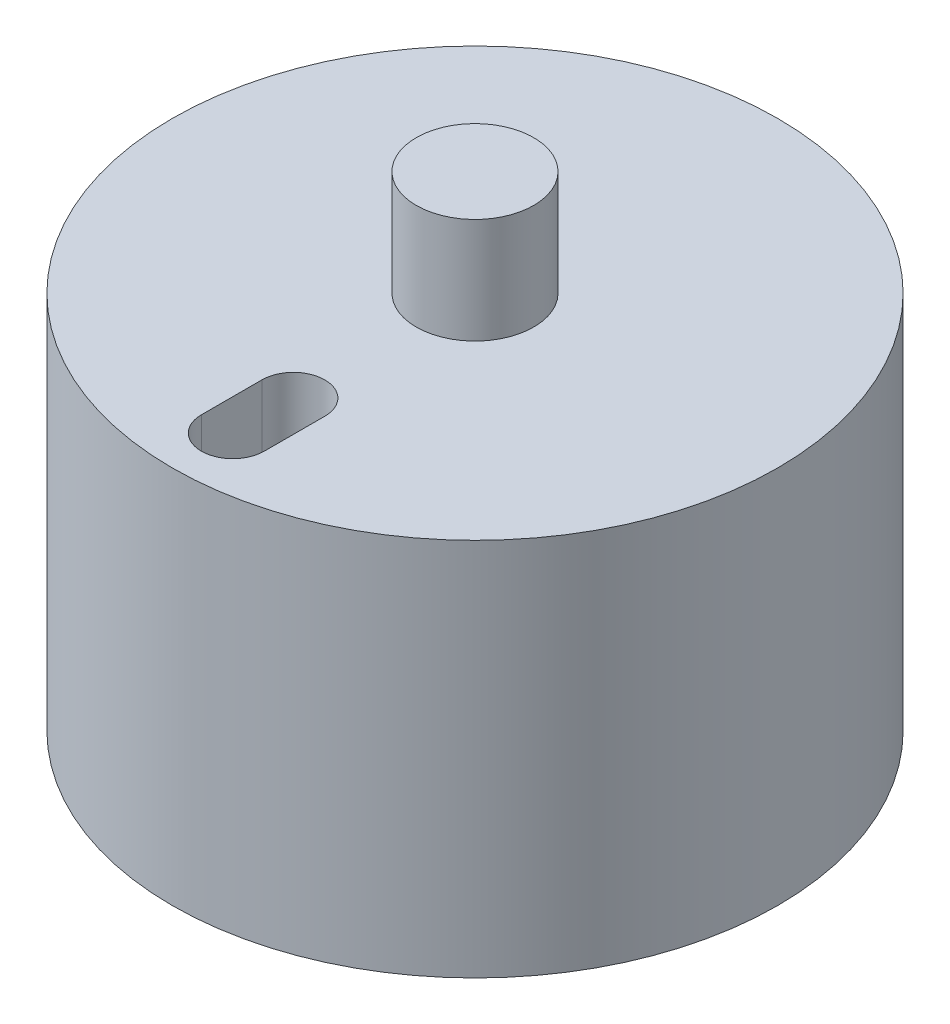
ISO-10303-21;
HEADER;
FILE_DESCRIPTION(('STEP AP214'),'2;1');
FILE_NAME('part.step','',(''),(''),'','','');
FILE_SCHEMA(('AUTOMOTIVE_DESIGN { 1 0 10303 214 1 1 1 1 }'));
ENDSEC;
DATA;
#1=APPLICATION_CONTEXT('core data for automotive mechanical design processes');
#2=APPLICATION_PROTOCOL_DEFINITION('international standard','automotive_design',2000,#1);
#3=PRODUCT_CONTEXT('',#1,'mechanical');
#4=PRODUCT('Part','Part','',(#3));
#5=PRODUCT_RELATED_PRODUCT_CATEGORY('part','',(#4));
#6=PRODUCT_DEFINITION_FORMATION('','',#4);
#7=PRODUCT_DEFINITION_CONTEXT('part definition',#1,'design');
#8=PRODUCT_DEFINITION('design','',#6,#7);
#9=PRODUCT_DEFINITION_SHAPE('','',#8);
#10=(LENGTH_UNIT() NAMED_UNIT(*) SI_UNIT(.MILLI.,.METRE.));
#11=(NAMED_UNIT(*) PLANE_ANGLE_UNIT() SI_UNIT($,.RADIAN.));
#12=(NAMED_UNIT(*) SI_UNIT($,.STERADIAN.) SOLID_ANGLE_UNIT());
#13=UNCERTAINTY_MEASURE_WITH_UNIT(LENGTH_MEASURE(1.E-05),#10,'distance_accuracy_value','');
#14=(GEOMETRIC_REPRESENTATION_CONTEXT(3) GLOBAL_UNCERTAINTY_ASSIGNED_CONTEXT((#13)) GLOBAL_UNIT_ASSIGNED_CONTEXT((#10,
#11,#12)) REPRESENTATION_CONTEXT('',''));
#15=CARTESIAN_POINT('',(0.,0.,0.));
#16=DIRECTION('',(0.,0.,1.));
#17=DIRECTION('',(1.,0.,0.));
#18=AXIS2_PLACEMENT_3D('',#15,#16,#17);
#19=CARTESIAN_POINT('',(0.,40.,0.));
#20=DIRECTION('',(0.,-1.,0.));
#21=DIRECTION('',(0.,0.,-1.));
#22=AXIS2_PLACEMENT_3D('',#19,#20,#21);
#23=CYLINDRICAL_SURFACE('',#22,25.);
#24=CARTESIAN_POINT('',(0.,0.,0.));
#25=DIRECTION('',(0.,1.,0.));
#26=DIRECTION('',(0.,0.,1.));
#27=AXIS2_PLACEMENT_3D('',#24,#25,#26);
#28=CIRCLE('',#27,25.);
#29=CARTESIAN_POINT('',(0.,0.,25.));
#30=VERTEX_POINT('',#29);
#31=EDGE_CURVE('E11',#30,#30,#28,.T.);
#32=ORIENTED_EDGE('',*,*,#31,.T.);
#33=EDGE_LOOP('',(#32));
#34=FACE_BOUND('',#33,.T.);
#35=CARTESIAN_POINT('',(0.,31.3,0.));
#36=DIRECTION('',(0.,1.,0.));
#37=DIRECTION('',(0.,0.,1.));
#38=AXIS2_PLACEMENT_3D('',#35,#36,#37);
#39=CIRCLE('',#38,25.);
#40=CARTESIAN_POINT('',(0.,31.3,25.));
#41=VERTEX_POINT('',#40);
#42=EDGE_CURVE('E46',#41,#41,#39,.T.);
#43=ORIENTED_EDGE('',*,*,#42,.F.);
#44=EDGE_LOOP('',(#43));
#45=FACE_BOUND('',#44,.T.);
#46=ADVANCED_FACE('F39',(#34,#45),#23,.T.);
#47=CARTESIAN_POINT('',(0.,0.,0.));
#48=DIRECTION('',(0.,1.,0.));
#49=DIRECTION('',(0.,0.,1.));
#50=AXIS2_PLACEMENT_3D('',#47,#48,#49);
#51=PLANE('',#50);
#52=CARTESIAN_POINT('',(0.,0.,17.5));
#53=DIRECTION('',(0.,1.,0.));
#54=DIRECTION('',(0.,0.,1.));
#55=AXIS2_PLACEMENT_3D('',#52,#53,#54);
#56=CIRCLE('',#55,1.5);
#57=CARTESIAN_POINT('',(0.,0.,19.));
#58=VERTEX_POINT('',#57);
#59=EDGE_CURVE('E110',#58,#58,#56,.T.);
#60=ORIENTED_EDGE('',*,*,#59,.T.);
#61=EDGE_LOOP('',(#60));
#62=FACE_BOUND('',#61,.T.);
#63=ORIENTED_EDGE('',*,*,#31,.F.);
#64=EDGE_LOOP('',(#63));
#65=FACE_BOUND('',#64,.T.);
#66=ADVANCED_FACE('F129',(#62,#65),#51,.F.);
#67=CARTESIAN_POINT('',(0.,31.3,0.));
#68=DIRECTION('',(0.,1.,0.));
#69=DIRECTION('',(0.,0.,1.));
#70=AXIS2_PLACEMENT_3D('',#67,#68,#69);
#71=PLANE('',#70);
#72=CARTESIAN_POINT('',(0.,31.3,15.));
#73=DIRECTION('',(0.,1.,0.));
#74=DIRECTION('',(0.,0.,1.));
#75=AXIS2_PLACEMENT_3D('',#72,#73,#74);
#76=CIRCLE('',#75,2.6);
#77=CARTESIAN_POINT('',(2.6,31.3,15.));
#78=VERTEX_POINT('',#77);
#79=CARTESIAN_POINT('',(-2.6,31.3,15.));
#80=VERTEX_POINT('',#79);
#81=EDGE_CURVE('E53',#78,#80,#76,.T.);
#82=ORIENTED_EDGE('',*,*,#81,.F.);
#83=DIRECTION('',(0.,0.,-1.));
#84=VECTOR('',#83,1.);
#85=CARTESIAN_POINT('',(2.6,31.3,15.));
#86=LINE('',#85,#84);
#87=CARTESIAN_POINT('',(2.6,31.3,20.));
#88=VERTEX_POINT('',#87);
#89=EDGE_CURVE('E104',#88,#78,#86,.T.);
#90=ORIENTED_EDGE('',*,*,#89,.F.);
#91=CARTESIAN_POINT('',(0.,31.3,20.));
#92=DIRECTION('',(0.,1.,0.));
#93=DIRECTION('',(0.,0.,1.));
#94=AXIS2_PLACEMENT_3D('',#91,#92,#93);
#95=CIRCLE('',#94,2.6);
#96=CARTESIAN_POINT('',(-2.6,31.3,20.));
#97=VERTEX_POINT('',#96);
#98=EDGE_CURVE('E112',#97,#88,#95,.T.);
#99=ORIENTED_EDGE('',*,*,#98,.F.);
#100=DIRECTION('',(0.,0.,1.));
#101=VECTOR('',#100,1.);
#102=CARTESIAN_POINT('',(-2.6,31.3,15.));
#103=LINE('',#102,#101);
#104=EDGE_CURVE('E88',#80,#97,#103,.T.);
#105=ORIENTED_EDGE('',*,*,#104,.F.);
#106=EDGE_LOOP('',(#82,#90,#99,#105));
#107=FACE_BOUND('',#106,.T.);
#108=CARTESIAN_POINT('',(0.,31.3,0.));
#109=DIRECTION('',(0.,1.,0.));
#110=DIRECTION('',(0.,0.,1.));
#111=AXIS2_PLACEMENT_3D('',#108,#109,#110);
#112=CIRCLE('',#111,4.85);
#113=CARTESIAN_POINT('',(0.,31.3,4.85));
#114=VERTEX_POINT('',#113);
#115=EDGE_CURVE('E119',#114,#114,#112,.T.);
#116=ORIENTED_EDGE('',*,*,#115,.F.);
#117=EDGE_LOOP('',(#116));
#118=FACE_BOUND('',#117,.T.);
#119=ORIENTED_EDGE('',*,*,#42,.T.);
#120=EDGE_LOOP('',(#119));
#121=FACE_BOUND('',#120,.T.);
#122=ADVANCED_FACE('F126',(#107,#118,#121),#71,.T.);
#123=CARTESIAN_POINT('',(0.,31.3,0.));
#124=DIRECTION('',(0.,1.,0.));
#125=DIRECTION('',(0.,0.,1.));
#126=AXIS2_PLACEMENT_3D('',#123,#124,#125);
#127=CYLINDRICAL_SURFACE('',#126,4.85);
#128=ORIENTED_EDGE('',*,*,#115,.T.);
#129=EDGE_LOOP('',(#128));
#130=FACE_BOUND('',#129,.T.);
#131=CARTESIAN_POINT('',(0.,40.,0.));
#132=DIRECTION('',(0.,1.,0.));
#133=DIRECTION('',(0.,0.,1.));
#134=AXIS2_PLACEMENT_3D('',#131,#132,#133);
#135=CIRCLE('',#134,4.85);
#136=CARTESIAN_POINT('',(0.,40.,4.85));
#137=VERTEX_POINT('',#136);
#138=EDGE_CURVE('E116',#137,#137,#135,.T.);
#139=ORIENTED_EDGE('',*,*,#138,.F.);
#140=EDGE_LOOP('',(#139));
#141=FACE_BOUND('',#140,.T.);
#142=ADVANCED_FACE('F143',(#130,#141),#127,.T.);
#143=CARTESIAN_POINT('',(0.,40.,0.));
#144=DIRECTION('',(0.,1.,0.));
#145=DIRECTION('',(0.,0.,1.));
#146=AXIS2_PLACEMENT_3D('',#143,#144,#145);
#147=PLANE('',#146);
#148=ORIENTED_EDGE('',*,*,#138,.T.);
#149=EDGE_LOOP('',(#148));
#150=FACE_BOUND('',#149,.T.);
#151=ADVANCED_FACE('F148',(#150),#147,.T.);
#152=CARTESIAN_POINT('',(0.,21.3,15.));
#153=DIRECTION('',(0.,1.,0.));
#154=DIRECTION('',(0.,0.,1.));
#155=AXIS2_PLACEMENT_3D('',#152,#153,#154);
#156=CYLINDRICAL_SURFACE('',#155,2.6);
#157=ORIENTED_EDGE('',*,*,#81,.T.);
#158=DIRECTION('',(0.,1.,0.));
#159=VECTOR('',#158,1.);
#160=CARTESIAN_POINT('',(-2.6,21.3,15.));
#161=LINE('',#160,#159);
#162=CARTESIAN_POINT('',(-2.6,21.3,15.));
#163=VERTEX_POINT('',#162);
#164=EDGE_CURVE('E76',#163,#80,#161,.T.);
#165=ORIENTED_EDGE('',*,*,#164,.F.);
#166=CARTESIAN_POINT('',(0.,21.3,15.));
#167=DIRECTION('',(0.,1.,0.));
#168=DIRECTION('',(0.,0.,1.));
#169=AXIS2_PLACEMENT_3D('',#166,#167,#168);
#170=CIRCLE('',#169,2.6);
#171=CARTESIAN_POINT('',(2.6,21.3,15.));
#172=VERTEX_POINT('',#171);
#173=EDGE_CURVE('E102',#172,#163,#170,.T.);
#174=ORIENTED_EDGE('',*,*,#173,.F.);
#175=DIRECTION('',(0.,1.,0.));
#176=VECTOR('',#175,1.);
#177=CARTESIAN_POINT('',(2.6,21.3,15.));
#178=LINE('',#177,#176);
#179=EDGE_CURVE('E61',#172,#78,#178,.T.);
#180=ORIENTED_EDGE('',*,*,#179,.T.);
#181=EDGE_LOOP('',(#157,#165,#174,#180));
#182=FACE_BOUND('',#181,.T.);
#183=ADVANCED_FACE('F150',(#182),#156,.F.);
#184=CARTESIAN_POINT('',(2.6,21.3,15.));
#185=DIRECTION('',(1.,0.,0.));
#186=DIRECTION('',(0.,0.,-1.));
#187=AXIS2_PLACEMENT_3D('',#184,#185,#186);
#188=PLANE('',#187);
#189=ORIENTED_EDGE('',*,*,#89,.T.);
#190=ORIENTED_EDGE('',*,*,#179,.F.);
#191=DIRECTION('',(0.,0.,-1.));
#192=VECTOR('',#191,1.);
#193=CARTESIAN_POINT('',(2.6,21.3,15.));
#194=LINE('',#193,#192);
#195=CARTESIAN_POINT('',(2.6,21.3,20.));
#196=VERTEX_POINT('',#195);
#197=EDGE_CURVE('E99',#196,#172,#194,.T.);
#198=ORIENTED_EDGE('',*,*,#197,.F.);
#199=DIRECTION('',(0.,1.,0.));
#200=VECTOR('',#199,1.);
#201=CARTESIAN_POINT('',(2.6,21.3,20.));
#202=LINE('',#201,#200);
#203=EDGE_CURVE('E92',#196,#88,#202,.T.);
#204=ORIENTED_EDGE('',*,*,#203,.T.);
#205=EDGE_LOOP('',(#189,#190,#198,#204));
#206=FACE_BOUND('',#205,.T.);
#207=ADVANCED_FACE('F157',(#206),#188,.F.);
#208=CARTESIAN_POINT('',(0.,21.3,20.));
#209=DIRECTION('',(0.,1.,0.));
#210=DIRECTION('',(0.,0.,1.));
#211=AXIS2_PLACEMENT_3D('',#208,#209,#210);
#212=CYLINDRICAL_SURFACE('',#211,2.6);
#213=ORIENTED_EDGE('',*,*,#98,.T.);
#214=ORIENTED_EDGE('',*,*,#203,.F.);
#215=CARTESIAN_POINT('',(0.,21.3,20.));
#216=DIRECTION('',(0.,1.,0.));
#217=DIRECTION('',(0.,0.,1.));
#218=AXIS2_PLACEMENT_3D('',#215,#216,#217);
#219=CIRCLE('',#218,2.6);
#220=CARTESIAN_POINT('',(-2.6,21.3,20.));
#221=VERTEX_POINT('',#220);
#222=EDGE_CURVE('E95',#221,#196,#219,.T.);
#223=ORIENTED_EDGE('',*,*,#222,.F.);
#224=DIRECTION('',(0.,1.,0.));
#225=VECTOR('',#224,1.);
#226=CARTESIAN_POINT('',(-2.6,21.3,20.));
#227=LINE('',#226,#225);
#228=EDGE_CURVE('E81',#221,#97,#227,.T.);
#229=ORIENTED_EDGE('',*,*,#228,.T.);
#230=EDGE_LOOP('',(#213,#214,#223,#229));
#231=FACE_BOUND('',#230,.T.);
#232=ADVANCED_FACE('F96',(#231),#212,.F.);
#233=CARTESIAN_POINT('',(-2.6,21.3,15.));
#234=DIRECTION('',(-1.,0.,0.));
#235=DIRECTION('',(0.,0.,1.));
#236=AXIS2_PLACEMENT_3D('',#233,#234,#235);
#237=PLANE('',#236);
#238=ORIENTED_EDGE('',*,*,#104,.T.);
#239=ORIENTED_EDGE('',*,*,#228,.F.);
#240=DIRECTION('',(0.,0.,1.));
#241=VECTOR('',#240,1.);
#242=CARTESIAN_POINT('',(-2.6,21.3,15.));
#243=LINE('',#242,#241);
#244=EDGE_CURVE('E85',#163,#221,#243,.T.);
#245=ORIENTED_EDGE('',*,*,#244,.F.);
#246=ORIENTED_EDGE('',*,*,#164,.T.);
#247=EDGE_LOOP('',(#238,#239,#245,#246));
#248=FACE_BOUND('',#247,.T.);
#249=ADVANCED_FACE('F83',(#248),#237,.F.);
#250=CARTESIAN_POINT('',(0.,21.3,15.));
#251=DIRECTION('',(0.,1.,0.));
#252=DIRECTION('',(0.,0.,1.));
#253=AXIS2_PLACEMENT_3D('',#250,#251,#252);
#254=PLANE('',#253);
#255=CARTESIAN_POINT('',(0.,21.3,17.5));
#256=DIRECTION('',(0.,1.,0.));
#257=DIRECTION('',(0.,0.,1.));
#258=AXIS2_PLACEMENT_3D('',#255,#256,#257);
#259=CIRCLE('',#258,1.5);
#260=CARTESIAN_POINT('',(0.,21.3,19.));
#261=VERTEX_POINT('',#260);
#262=EDGE_CURVE('E174',#261,#261,#259,.T.);
#263=ORIENTED_EDGE('',*,*,#262,.F.);
#264=EDGE_LOOP('',(#263));
#265=FACE_BOUND('',#264,.T.);
#266=ORIENTED_EDGE('',*,*,#173,.T.);
#267=ORIENTED_EDGE('',*,*,#244,.T.);
#268=ORIENTED_EDGE('',*,*,#222,.T.);
#269=ORIENTED_EDGE('',*,*,#197,.T.);
#270=EDGE_LOOP('',(#266,#267,#268,#269));
#271=FACE_BOUND('',#270,.T.);
#272=ADVANCED_FACE('F101',(#265,#271),#254,.T.);
#273=CARTESIAN_POINT('',(0.,0.,17.5));
#274=DIRECTION('',(0.,1.,0.));
#275=DIRECTION('',(0.,0.,1.));
#276=AXIS2_PLACEMENT_3D('',#273,#274,#275);
#277=CYLINDRICAL_SURFACE('',#276,1.5);
#278=ORIENTED_EDGE('',*,*,#59,.F.);
#279=EDGE_LOOP('',(#278));
#280=FACE_BOUND('',#279,.T.);
#281=ORIENTED_EDGE('',*,*,#262,.T.);
#282=EDGE_LOOP('',(#281));
#283=FACE_BOUND('',#282,.T.);
#284=ADVANCED_FACE('F164',(#280,#283),#277,.F.);
#285=CLOSED_SHELL('',(#46,#66,#122,#142,#151,#183,#207,#232,#249,#272,#284));
#286=MANIFOLD_SOLID_BREP('B2',#285);
#287=ADVANCED_BREP_SHAPE_REPRESENTATION('',(#18,#286),#14);
#288=SHAPE_DEFINITION_REPRESENTATION(#9,#287);
ENDSEC;
END-ISO-10303-21;
